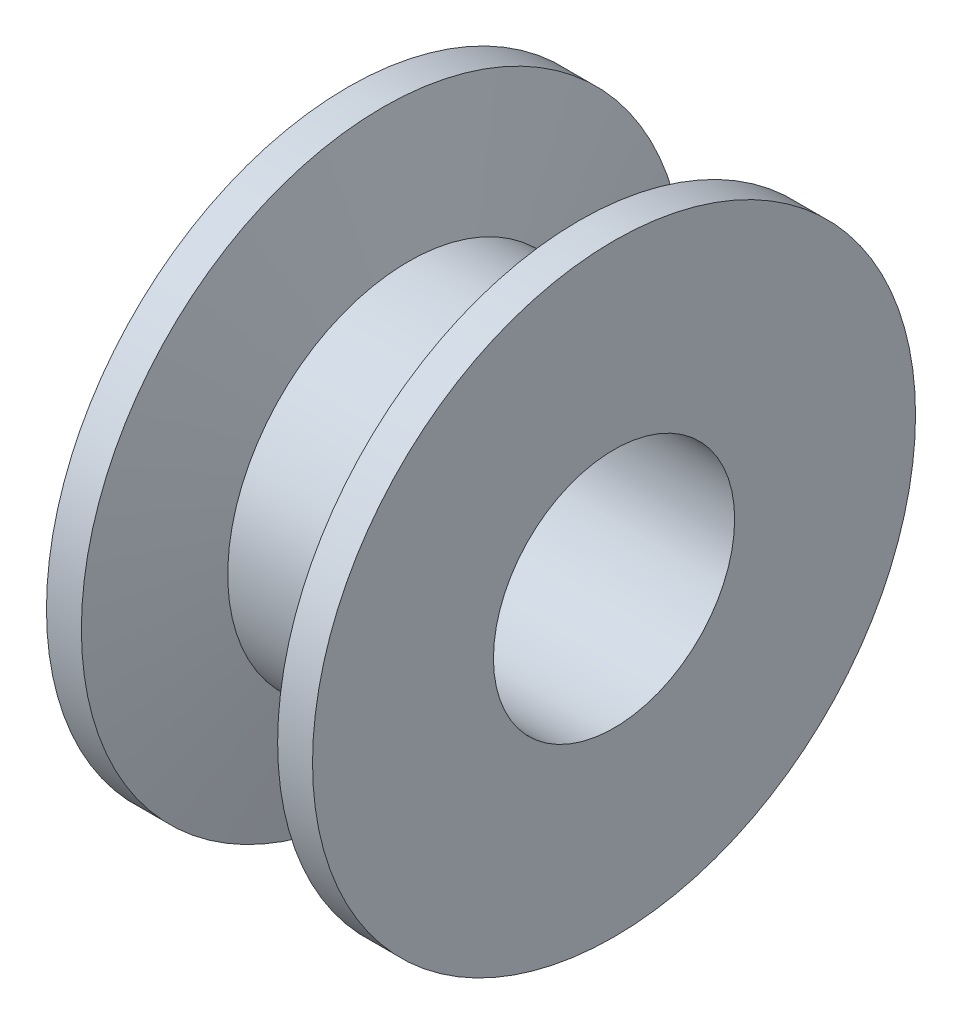
ISO-10303-21;
HEADER;
FILE_DESCRIPTION(('STEP AP214'),'2;1');
FILE_NAME('part.step','',(''),(''),'','','');
FILE_SCHEMA(('AUTOMOTIVE_DESIGN { 1 0 10303 214 1 1 1 1 }'));
ENDSEC;
DATA;
#1=APPLICATION_CONTEXT('core data for automotive mechanical design processes');
#2=APPLICATION_PROTOCOL_DEFINITION('international standard','automotive_design',2000,#1);
#3=PRODUCT_CONTEXT('',#1,'mechanical');
#4=PRODUCT('Part','Part','',(#3));
#5=PRODUCT_RELATED_PRODUCT_CATEGORY('part','',(#4));
#6=PRODUCT_DEFINITION_FORMATION('','',#4);
#7=PRODUCT_DEFINITION_CONTEXT('part definition',#1,'design');
#8=PRODUCT_DEFINITION('design','',#6,#7);
#9=PRODUCT_DEFINITION_SHAPE('','',#8);
#10=(LENGTH_UNIT() NAMED_UNIT(*) SI_UNIT(.MILLI.,.METRE.));
#11=(NAMED_UNIT(*) PLANE_ANGLE_UNIT() SI_UNIT($,.RADIAN.));
#12=(NAMED_UNIT(*) SI_UNIT($,.STERADIAN.) SOLID_ANGLE_UNIT());
#13=UNCERTAINTY_MEASURE_WITH_UNIT(LENGTH_MEASURE(1.E-05),#10,'distance_accuracy_value','');
#14=(GEOMETRIC_REPRESENTATION_CONTEXT(3) GLOBAL_UNCERTAINTY_ASSIGNED_CONTEXT((#13)) GLOBAL_UNIT_ASSIGNED_CONTEXT((#10,
#11,#12)) REPRESENTATION_CONTEXT('',''));
#15=CARTESIAN_POINT('',(0.,0.,0.));
#16=DIRECTION('',(0.,0.,1.));
#17=DIRECTION('',(1.,0.,0.));
#18=AXIS2_PLACEMENT_3D('',#15,#16,#17);
#19=CARTESIAN_POINT('',(11.0314524303627,0.,0.));
#20=DIRECTION('',(1.,0.,0.));
#21=DIRECTION('',(0.,0.,-1.));
#22=AXIS2_PLACEMENT_3D('',#19,#20,#21);
#23=CYLINDRICAL_SURFACE('',#22,25.);
#24=CARTESIAN_POINT('',(8.13657410609274,0.,0.));
#25=DIRECTION('',(1.,0.,0.));
#26=DIRECTION('',(0.,0.,-1.));
#27=AXIS2_PLACEMENT_3D('',#24,#25,#26);
#28=CIRCLE('',#27,25.);
#29=CARTESIAN_POINT('',(8.13657410609274,0.,-25.));
#30=VERTEX_POINT('',#29);
#31=EDGE_CURVE('E59',#30,#30,#28,.T.);
#32=ORIENTED_EDGE('',*,*,#31,.T.);
#33=EDGE_LOOP('',(#32));
#34=FACE_BOUND('',#33,.T.);
#35=CARTESIAN_POINT('',(11.0314524303627,0.,0.));
#36=DIRECTION('',(1.,0.,0.));
#37=DIRECTION('',(0.,0.,-1.));
#38=AXIS2_PLACEMENT_3D('',#35,#36,#37);
#39=CIRCLE('',#38,25.);
#40=CARTESIAN_POINT('',(11.0314524303627,0.,-25.));
#41=VERTEX_POINT('',#40);
#42=EDGE_CURVE('E10',#41,#41,#39,.T.);
#43=ORIENTED_EDGE('',*,*,#42,.F.);
#44=EDGE_LOOP('',(#43));
#45=FACE_BOUND('',#44,.T.);
#46=ADVANCED_FACE('F31',(#34,#45),#23,.T.);
#47=CARTESIAN_POINT('',(11.0314524303627,25.,0.));
#48=DIRECTION('',(1.,0.,0.));
#49=DIRECTION('',(0.,0.,-1.));
#50=AXIS2_PLACEMENT_3D('',#47,#48,#49);
#51=PLANE('',#50);
#52=ORIENTED_EDGE('',*,*,#42,.T.);
#53=EDGE_LOOP('',(#52));
#54=FACE_BOUND('',#53,.T.);
#55=CARTESIAN_POINT('',(11.0314524303627,0.,0.));
#56=DIRECTION('',(1.,0.,0.));
#57=DIRECTION('',(0.,0.,-1.));
#58=AXIS2_PLACEMENT_3D('',#55,#56,#57);
#59=CIRCLE('',#58,10.);
#60=CARTESIAN_POINT('',(11.0314524303627,0.,-10.));
#61=VERTEX_POINT('',#60);
#62=EDGE_CURVE('E37',#61,#61,#59,.T.);
#63=ORIENTED_EDGE('',*,*,#62,.F.);
#64=EDGE_LOOP('',(#63));
#65=FACE_BOUND('',#64,.T.);
#66=ADVANCED_FACE('F77',(#54,#65),#51,.T.);
#67=CARTESIAN_POINT('',(11.0314524303627,0.,0.));
#68=DIRECTION('',(1.,0.,0.));
#69=DIRECTION('',(0.,0.,-1.));
#70=AXIS2_PLACEMENT_3D('',#67,#68,#69);
#71=CYLINDRICAL_SURFACE('',#70,10.);
#72=ORIENTED_EDGE('',*,*,#62,.T.);
#73=EDGE_LOOP('',(#72));
#74=FACE_BOUND('',#73,.T.);
#75=CARTESIAN_POINT('',(-11.0314524303627,0.,0.));
#76=DIRECTION('',(1.,0.,0.));
#77=DIRECTION('',(0.,0.,-1.));
#78=AXIS2_PLACEMENT_3D('',#75,#76,#77);
#79=CIRCLE('',#78,10.);
#80=CARTESIAN_POINT('',(-11.0314524303627,0.,-10.));
#81=VERTEX_POINT('',#80);
#82=EDGE_CURVE('E41',#81,#81,#79,.T.);
#83=ORIENTED_EDGE('',*,*,#82,.F.);
#84=EDGE_LOOP('',(#83));
#85=FACE_BOUND('',#84,.T.);
#86=ADVANCED_FACE('F81',(#74,#85),#71,.F.);
#87=CARTESIAN_POINT('',(-11.0314524303627,25.,0.));
#88=DIRECTION('',(-1.,0.,0.));
#89=DIRECTION('',(0.,0.,1.));
#90=AXIS2_PLACEMENT_3D('',#87,#88,#89);
#91=PLANE('',#90);
#92=ORIENTED_EDGE('',*,*,#82,.T.);
#93=EDGE_LOOP('',(#92));
#94=FACE_BOUND('',#93,.T.);
#95=CARTESIAN_POINT('',(-11.0314524303627,0.,0.));
#96=DIRECTION('',(1.,0.,0.));
#97=DIRECTION('',(0.,0.,-1.));
#98=AXIS2_PLACEMENT_3D('',#95,#96,#97);
#99=CIRCLE('',#98,25.);
#100=CARTESIAN_POINT('',(-11.0314524303627,0.,-25.));
#101=VERTEX_POINT('',#100);
#102=EDGE_CURVE('E45',#101,#101,#99,.T.);
#103=ORIENTED_EDGE('',*,*,#102,.F.);
#104=EDGE_LOOP('',(#103));
#105=FACE_BOUND('',#104,.T.);
#106=ADVANCED_FACE('F85',(#94,#105),#91,.T.);
#107=CARTESIAN_POINT('',(11.0314524303627,0.,0.));
#108=DIRECTION('',(1.,0.,0.));
#109=DIRECTION('',(0.,0.,-1.));
#110=AXIS2_PLACEMENT_3D('',#107,#108,#109);
#111=CYLINDRICAL_SURFACE('',#110,25.);
#112=ORIENTED_EDGE('',*,*,#102,.T.);
#113=EDGE_LOOP('',(#112));
#114=FACE_BOUND('',#113,.T.);
#115=CARTESIAN_POINT('',(-8.13657410609274,0.,0.));
#116=DIRECTION('',(1.,0.,0.));
#117=DIRECTION('',(0.,0.,-1.));
#118=AXIS2_PLACEMENT_3D('',#115,#116,#117);
#119=CIRCLE('',#118,25.);
#120=CARTESIAN_POINT('',(-8.13657410609274,0.,-25.));
#121=VERTEX_POINT('',#120);
#122=EDGE_CURVE('E50',#121,#121,#119,.T.);
#123=ORIENTED_EDGE('',*,*,#122,.F.);
#124=EDGE_LOOP('',(#123));
#125=FACE_BOUND('',#124,.T.);
#126=ADVANCED_FACE('F91',(#114,#125),#111,.T.);
#127=CARTESIAN_POINT('',(-6.,0.,0.));
#128=DIRECTION('',(-1.,0.,0.));
#129=DIRECTION('',(0.,0.,1.));
#130=AXIS2_PLACEMENT_3D('',#127,#128,#129);
#131=CONICAL_SURFACE('',#130,15.,1.36030379045043);
#132=ORIENTED_EDGE('',*,*,#122,.T.);
#133=EDGE_LOOP('',(#132));
#134=FACE_BOUND('',#133,.T.);
#135=CARTESIAN_POINT('',(-6.,0.,0.));
#136=DIRECTION('',(1.,0.,0.));
#137=DIRECTION('',(0.,0.,-1.));
#138=AXIS2_PLACEMENT_3D('',#135,#136,#137);
#139=CIRCLE('',#138,15.);
#140=CARTESIAN_POINT('',(-6.,0.,-15.));
#141=VERTEX_POINT('',#140);
#142=EDGE_CURVE('E53',#141,#141,#139,.T.);
#143=ORIENTED_EDGE('',*,*,#142,.F.);
#144=EDGE_LOOP('',(#143));
#145=FACE_BOUND('',#144,.T.);
#146=ADVANCED_FACE('F73',(#134,#145),#131,.T.);
#147=CARTESIAN_POINT('',(11.0314524303627,0.,0.));
#148=DIRECTION('',(1.,0.,0.));
#149=DIRECTION('',(0.,0.,-1.));
#150=AXIS2_PLACEMENT_3D('',#147,#148,#149);
#151=CYLINDRICAL_SURFACE('',#150,15.);
#152=ORIENTED_EDGE('',*,*,#142,.T.);
#153=EDGE_LOOP('',(#152));
#154=FACE_BOUND('',#153,.T.);
#155=CARTESIAN_POINT('',(6.,0.,0.));
#156=DIRECTION('',(1.,0.,0.));
#157=DIRECTION('',(0.,0.,-1.));
#158=AXIS2_PLACEMENT_3D('',#155,#156,#157);
#159=CIRCLE('',#158,15.);
#160=CARTESIAN_POINT('',(6.,0.,-15.));
#161=VERTEX_POINT('',#160);
#162=EDGE_CURVE('E56',#161,#161,#159,.T.);
#163=ORIENTED_EDGE('',*,*,#162,.F.);
#164=EDGE_LOOP('',(#163));
#165=FACE_BOUND('',#164,.T.);
#166=ADVANCED_FACE('F67',(#154,#165),#151,.T.);
#167=CARTESIAN_POINT('',(8.13657410609274,0.,0.));
#168=DIRECTION('',(1.,0.,0.));
#169=DIRECTION('',(0.,0.,-1.));
#170=AXIS2_PLACEMENT_3D('',#167,#168,#169);
#171=CONICAL_SURFACE('',#170,25.,1.36030379045043);
#172=ORIENTED_EDGE('',*,*,#162,.T.);
#173=EDGE_LOOP('',(#172));
#174=FACE_BOUND('',#173,.T.);
#175=ORIENTED_EDGE('',*,*,#31,.F.);
#176=EDGE_LOOP('',(#175));
#177=FACE_BOUND('',#176,.T.);
#178=ADVANCED_FACE('F65',(#174,#177),#171,.T.);
#179=CLOSED_SHELL('',(#46,#66,#86,#106,#126,#146,#166,#178));
#180=MANIFOLD_SOLID_BREP('B2',#179);
#181=ADVANCED_BREP_SHAPE_REPRESENTATION('',(#18,#180),#14);
#182=SHAPE_DEFINITION_REPRESENTATION(#9,#181);
ENDSEC;
END-ISO-10303-21;
